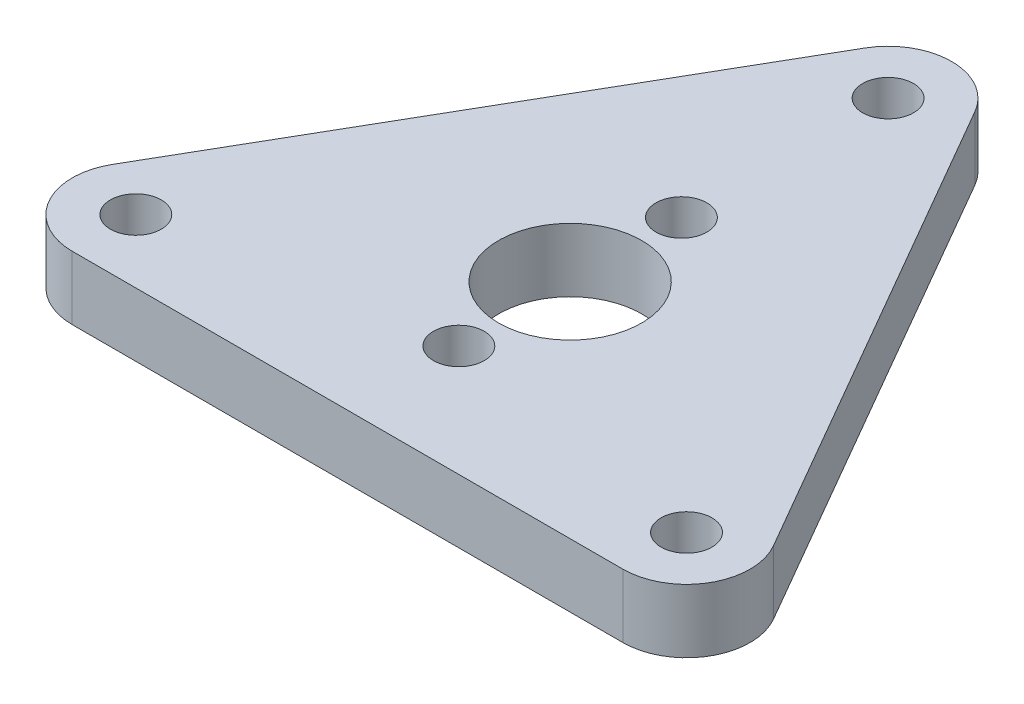
ISO-10303-21;
HEADER;
FILE_DESCRIPTION(('STEP AP214'),'2;1');
FILE_NAME('part.step','',(''),(''),'','','');
FILE_SCHEMA(('AUTOMOTIVE_DESIGN { 1 0 10303 214 1 1 1 1 }'));
ENDSEC;
DATA;
#1=APPLICATION_CONTEXT('core data for automotive mechanical design processes');
#2=APPLICATION_PROTOCOL_DEFINITION('international standard','automotive_design',2000,#1);
#3=PRODUCT_CONTEXT('',#1,'mechanical');
#4=PRODUCT('Part','Part','',(#3));
#5=PRODUCT_RELATED_PRODUCT_CATEGORY('part','',(#4));
#6=PRODUCT_DEFINITION_FORMATION('','',#4);
#7=PRODUCT_DEFINITION_CONTEXT('part definition',#1,'design');
#8=PRODUCT_DEFINITION('design','',#6,#7);
#9=PRODUCT_DEFINITION_SHAPE('','',#8);
#10=(LENGTH_UNIT() NAMED_UNIT(*) SI_UNIT(.MILLI.,.METRE.));
#11=(NAMED_UNIT(*) PLANE_ANGLE_UNIT() SI_UNIT($,.RADIAN.));
#12=(NAMED_UNIT(*) SI_UNIT($,.STERADIAN.) SOLID_ANGLE_UNIT());
#13=UNCERTAINTY_MEASURE_WITH_UNIT(LENGTH_MEASURE(1.E-05),#10,'distance_accuracy_value','');
#14=(GEOMETRIC_REPRESENTATION_CONTEXT(3) GLOBAL_UNCERTAINTY_ASSIGNED_CONTEXT((#13)) GLOBAL_UNIT_ASSIGNED_CONTEXT((#10,
#11,#12)) REPRESENTATION_CONTEXT('',''));
#15=CARTESIAN_POINT('',(0.,0.,0.));
#16=DIRECTION('',(0.,0.,1.));
#17=DIRECTION('',(1.,0.,0.));
#18=AXIS2_PLACEMENT_3D('',#15,#16,#17);
#19=CARTESIAN_POINT('',(17.3205080756888,2.,9.99999999999999));
#20=DIRECTION('',(0.,1.,0.));
#21=DIRECTION('',(0.,0.,1.));
#22=AXIS2_PLACEMENT_3D('',#19,#20,#21);
#23=PLANE('',#22);
#24=CARTESIAN_POINT('',(-17.3205080756888,2.,10.));
#25=DIRECTION('',(0.,1.,0.));
#26=DIRECTION('',(0.,0.,1.));
#27=AXIS2_PLACEMENT_3D('',#24,#25,#26);
#28=CIRCLE('',#27,1.6);
#29=CARTESIAN_POINT('',(-17.3205080756888,2.,11.6));
#30=VERTEX_POINT('',#29);
#31=EDGE_CURVE('E199',#30,#30,#28,.T.);
#32=ORIENTED_EDGE('',*,*,#31,.F.);
#33=EDGE_LOOP('',(#32));
#34=FACE_BOUND('',#33,.T.);
#35=CARTESIAN_POINT('',(0.,2.,-20.));
#36=DIRECTION('',(0.,1.,0.));
#37=DIRECTION('',(0.,0.,1.));
#38=AXIS2_PLACEMENT_3D('',#35,#36,#37);
#39=CIRCLE('',#38,1.6);
#40=CARTESIAN_POINT('',(0.,2.,-18.4));
#41=VERTEX_POINT('',#40);
#42=EDGE_CURVE('E211',#41,#41,#39,.T.);
#43=ORIENTED_EDGE('',*,*,#42,.F.);
#44=EDGE_LOOP('',(#43));
#45=FACE_BOUND('',#44,.T.);
#46=CARTESIAN_POINT('',(0.,2.,-7.));
#47=DIRECTION('',(0.,1.,0.));
#48=DIRECTION('',(0.,0.,1.));
#49=AXIS2_PLACEMENT_3D('',#46,#47,#48);
#50=CIRCLE('',#49,1.6);
#51=CARTESIAN_POINT('',(0.,2.,-5.4));
#52=VERTEX_POINT('',#51);
#53=EDGE_CURVE('E124',#52,#52,#50,.T.);
#54=ORIENTED_EDGE('',*,*,#53,.F.);
#55=EDGE_LOOP('',(#54));
#56=FACE_BOUND('',#55,.T.);
#57=CARTESIAN_POINT('',(17.3205080756888,2.,9.99999999999999));
#58=DIRECTION('',(0.,1.,0.));
#59=DIRECTION('',(0.,0.,1.));
#60=AXIS2_PLACEMENT_3D('',#57,#58,#59);
#61=CIRCLE('',#60,3.99999999999999);
#62=CARTESIAN_POINT('',(17.3205080756888,2.,14.));
#63=VERTEX_POINT('',#62);
#64=CARTESIAN_POINT('',(20.7846096908265,2.,8.));
#65=VERTEX_POINT('',#64);
#66=EDGE_CURVE('E131',#63,#65,#61,.T.);
#67=ORIENTED_EDGE('',*,*,#66,.T.);
#68=DIRECTION('',(-0.5,0.,-0.866025403784439));
#69=VECTOR('',#68,1.);
#70=CARTESIAN_POINT('',(20.7846096908265,2.,8.));
#71=LINE('',#70,#69);
#72=CARTESIAN_POINT('',(3.46410161513776,2.,-22.));
#73=VERTEX_POINT('',#72);
#74=EDGE_CURVE('E89',#65,#73,#71,.T.);
#75=ORIENTED_EDGE('',*,*,#74,.T.);
#76=CARTESIAN_POINT('',(0.,2.,-20.));
#77=DIRECTION('',(0.,1.,0.));
#78=DIRECTION('',(0.,0.,-1.));
#79=AXIS2_PLACEMENT_3D('',#76,#77,#78);
#80=CIRCLE('',#79,4.);
#81=CARTESIAN_POINT('',(-3.46410161513774,2.,-22.));
#82=VERTEX_POINT('',#81);
#83=EDGE_CURVE('E102',#73,#82,#80,.T.);
#84=ORIENTED_EDGE('',*,*,#83,.T.);
#85=DIRECTION('',(-0.500000000000001,0.,0.866025403784438));
#86=VECTOR('',#85,1.);
#87=CARTESIAN_POINT('',(-3.46410161513774,2.,-22.));
#88=LINE('',#87,#86);
#89=CARTESIAN_POINT('',(-20.7846096908265,2.,7.99999999999999));
#90=VERTEX_POINT('',#89);
#91=EDGE_CURVE('E96',#82,#90,#88,.T.);
#92=ORIENTED_EDGE('',*,*,#91,.T.);
#93=CARTESIAN_POINT('',(-17.3205080756888,2.,9.99999999999999));
#94=DIRECTION('',(0.,1.,0.));
#95=DIRECTION('',(0.,0.,1.));
#96=AXIS2_PLACEMENT_3D('',#93,#94,#95);
#97=CIRCLE('',#96,4.);
#98=CARTESIAN_POINT('',(-17.3205080756888,2.,14.));
#99=VERTEX_POINT('',#98);
#100=EDGE_CURVE('E100',#90,#99,#97,.T.);
#101=ORIENTED_EDGE('',*,*,#100,.T.);
#102=DIRECTION('',(1.,0.,0.));
#103=VECTOR('',#102,1.);
#104=CARTESIAN_POINT('',(-17.3205080756888,2.,14.));
#105=LINE('',#104,#103);
#106=EDGE_CURVE('E52',#99,#63,#105,.T.);
#107=ORIENTED_EDGE('',*,*,#106,.T.);
#108=EDGE_LOOP('',(#67,#75,#84,#92,#101,#107));
#109=FACE_BOUND('',#108,.T.);
#110=CARTESIAN_POINT('',(0.,2.,7.));
#111=DIRECTION('',(0.,1.,0.));
#112=DIRECTION('',(0.,0.,1.));
#113=AXIS2_PLACEMENT_3D('',#110,#111,#112);
#114=CIRCLE('',#113,1.6);
#115=CARTESIAN_POINT('',(0.,2.,8.6));
#116=VERTEX_POINT('',#115);
#117=EDGE_CURVE('E217',#116,#116,#114,.T.);
#118=ORIENTED_EDGE('',*,*,#117,.F.);
#119=EDGE_LOOP('',(#118));
#120=FACE_BOUND('',#119,.T.);
#121=CARTESIAN_POINT('',(17.3205080756888,2.,10.));
#122=DIRECTION('',(0.,1.,0.));
#123=DIRECTION('',(0.,0.,1.));
#124=AXIS2_PLACEMENT_3D('',#121,#122,#123);
#125=CIRCLE('',#124,1.6);
#126=CARTESIAN_POINT('',(17.3205080756888,2.,11.6));
#127=VERTEX_POINT('',#126);
#128=EDGE_CURVE('E205',#127,#127,#125,.T.);
#129=ORIENTED_EDGE('',*,*,#128,.F.);
#130=EDGE_LOOP('',(#129));
#131=FACE_BOUND('',#130,.T.);
#132=CARTESIAN_POINT('',(0.,2.,0.));
#133=DIRECTION('',(0.,1.,0.));
#134=DIRECTION('',(0.,0.,1.));
#135=AXIS2_PLACEMENT_3D('',#132,#133,#134);
#136=CIRCLE('',#135,4.5);
#137=CARTESIAN_POINT('',(0.,2.,4.5));
#138=VERTEX_POINT('',#137);
#139=EDGE_CURVE('E190',#138,#138,#136,.T.);
#140=ORIENTED_EDGE('',*,*,#139,.F.);
#141=EDGE_LOOP('',(#140));
#142=FACE_BOUND('',#141,.T.);
#143=ADVANCED_FACE('F35',(#34,#45,#56,#109,#120,#131,#142),#23,.T.);
#144=CARTESIAN_POINT('',(17.3205080756888,-2.,9.99999999999999));
#145=DIRECTION('',(0.,1.,0.));
#146=DIRECTION('',(0.,0.,1.));
#147=AXIS2_PLACEMENT_3D('',#144,#145,#146);
#148=PLANE('',#147);
#149=CARTESIAN_POINT('',(17.3205080756888,-2.,9.99999999999999));
#150=DIRECTION('',(0.,1.,0.));
#151=DIRECTION('',(0.,0.,1.));
#152=AXIS2_PLACEMENT_3D('',#149,#150,#151);
#153=CIRCLE('',#152,3.99999999999999);
#154=CARTESIAN_POINT('',(17.3205080756888,-2.,14.));
#155=VERTEX_POINT('',#154);
#156=CARTESIAN_POINT('',(20.7846096908265,-2.,8.));
#157=VERTEX_POINT('',#156);
#158=EDGE_CURVE('E120',#155,#157,#153,.T.);
#159=ORIENTED_EDGE('',*,*,#158,.F.);
#160=DIRECTION('',(1.,0.,0.));
#161=VECTOR('',#160,1.);
#162=CARTESIAN_POINT('',(-17.3205080756888,-2.,14.));
#163=LINE('',#162,#161);
#164=CARTESIAN_POINT('',(-17.3205080756888,-2.,14.));
#165=VERTEX_POINT('',#164);
#166=EDGE_CURVE('E81',#165,#155,#163,.T.);
#167=ORIENTED_EDGE('',*,*,#166,.F.);
#168=CARTESIAN_POINT('',(-17.3205080756888,-2.,9.99999999999999));
#169=DIRECTION('',(0.,1.,0.));
#170=DIRECTION('',(0.,0.,1.));
#171=AXIS2_PLACEMENT_3D('',#168,#169,#170);
#172=CIRCLE('',#171,4.);
#173=CARTESIAN_POINT('',(-20.7846096908265,-2.,7.99999999999999));
#174=VERTEX_POINT('',#173);
#175=EDGE_CURVE('E75',#174,#165,#172,.T.);
#176=ORIENTED_EDGE('',*,*,#175,.F.);
#177=DIRECTION('',(-0.500000000000001,0.,0.866025403784438));
#178=VECTOR('',#177,1.);
#179=CARTESIAN_POINT('',(-3.46410161513774,-2.,-22.));
#180=LINE('',#179,#178);
#181=CARTESIAN_POINT('',(-3.46410161513774,-2.,-22.));
#182=VERTEX_POINT('',#181);
#183=EDGE_CURVE('E110',#182,#174,#180,.T.);
#184=ORIENTED_EDGE('',*,*,#183,.F.);
#185=CARTESIAN_POINT('',(0.,-2.,-20.));
#186=DIRECTION('',(0.,1.,0.));
#187=DIRECTION('',(0.,0.,-1.));
#188=AXIS2_PLACEMENT_3D('',#185,#186,#187);
#189=CIRCLE('',#188,4.);
#190=CARTESIAN_POINT('',(3.46410161513776,-2.,-22.));
#191=VERTEX_POINT('',#190);
#192=EDGE_CURVE('E126',#191,#182,#189,.T.);
#193=ORIENTED_EDGE('',*,*,#192,.F.);
#194=DIRECTION('',(-0.5,0.,-0.866025403784439));
#195=VECTOR('',#194,1.);
#196=CARTESIAN_POINT('',(20.7846096908265,-2.,8.));
#197=LINE('',#196,#195);
#198=EDGE_CURVE('E123',#157,#191,#197,.T.);
#199=ORIENTED_EDGE('',*,*,#198,.F.);
#200=EDGE_LOOP('',(#159,#167,#176,#184,#193,#199));
#201=FACE_BOUND('',#200,.T.);
#202=CARTESIAN_POINT('',(0.,-2.,-7.));
#203=DIRECTION('',(0.,1.,0.));
#204=DIRECTION('',(0.,0.,1.));
#205=AXIS2_PLACEMENT_3D('',#202,#203,#204);
#206=CIRCLE('',#205,1.6);
#207=CARTESIAN_POINT('',(0.,-2.,-5.4));
#208=VERTEX_POINT('',#207);
#209=EDGE_CURVE('E220',#208,#208,#206,.T.);
#210=ORIENTED_EDGE('',*,*,#209,.T.);
#211=EDGE_LOOP('',(#210));
#212=FACE_BOUND('',#211,.T.);
#213=CARTESIAN_POINT('',(0.,-2.,7.));
#214=DIRECTION('',(0.,1.,0.));
#215=DIRECTION('',(0.,0.,1.));
#216=AXIS2_PLACEMENT_3D('',#213,#214,#215);
#217=CIRCLE('',#216,1.6);
#218=CARTESIAN_POINT('',(0.,-2.,8.6));
#219=VERTEX_POINT('',#218);
#220=EDGE_CURVE('E214',#219,#219,#217,.T.);
#221=ORIENTED_EDGE('',*,*,#220,.T.);
#222=EDGE_LOOP('',(#221));
#223=FACE_BOUND('',#222,.T.);
#224=CARTESIAN_POINT('',(0.,-2.,-20.));
#225=DIRECTION('',(0.,1.,0.));
#226=DIRECTION('',(0.,0.,1.));
#227=AXIS2_PLACEMENT_3D('',#224,#225,#226);
#228=CIRCLE('',#227,1.6);
#229=CARTESIAN_POINT('',(0.,-2.,-18.4));
#230=VERTEX_POINT('',#229);
#231=EDGE_CURVE('E208',#230,#230,#228,.T.);
#232=ORIENTED_EDGE('',*,*,#231,.T.);
#233=EDGE_LOOP('',(#232));
#234=FACE_BOUND('',#233,.T.);
#235=CARTESIAN_POINT('',(17.3205080756888,-2.,10.));
#236=DIRECTION('',(0.,1.,0.));
#237=DIRECTION('',(0.,0.,1.));
#238=AXIS2_PLACEMENT_3D('',#235,#236,#237);
#239=CIRCLE('',#238,1.6);
#240=CARTESIAN_POINT('',(17.3205080756888,-2.,11.6));
#241=VERTEX_POINT('',#240);
#242=EDGE_CURVE('E202',#241,#241,#239,.T.);
#243=ORIENTED_EDGE('',*,*,#242,.T.);
#244=EDGE_LOOP('',(#243));
#245=FACE_BOUND('',#244,.T.);
#246=CARTESIAN_POINT('',(-17.3205080756888,-2.,10.));
#247=DIRECTION('',(0.,1.,0.));
#248=DIRECTION('',(0.,0.,1.));
#249=AXIS2_PLACEMENT_3D('',#246,#247,#248);
#250=CIRCLE('',#249,1.6);
#251=CARTESIAN_POINT('',(-17.3205080756888,-2.,11.6));
#252=VERTEX_POINT('',#251);
#253=EDGE_CURVE('E196',#252,#252,#250,.T.);
#254=ORIENTED_EDGE('',*,*,#253,.T.);
#255=EDGE_LOOP('',(#254));
#256=FACE_BOUND('',#255,.T.);
#257=CARTESIAN_POINT('',(0.,-2.,0.));
#258=DIRECTION('',(0.,1.,0.));
#259=DIRECTION('',(0.,0.,1.));
#260=AXIS2_PLACEMENT_3D('',#257,#258,#259);
#261=CIRCLE('',#260,4.5);
#262=CARTESIAN_POINT('',(0.,-2.,4.5));
#263=VERTEX_POINT('',#262);
#264=EDGE_CURVE('E193',#263,#263,#261,.T.);
#265=ORIENTED_EDGE('',*,*,#264,.T.);
#266=EDGE_LOOP('',(#265));
#267=FACE_BOUND('',#266,.T.);
#268=ADVANCED_FACE('F140',(#201,#212,#223,#234,#245,#256,#267),#148,.F.);
#269=CARTESIAN_POINT('',(17.3205080756888,2.,9.99999999999999));
#270=DIRECTION('',(0.,-1.,0.));
#271=DIRECTION('',(0.,0.,-1.));
#272=AXIS2_PLACEMENT_3D('',#269,#270,#271);
#273=CYLINDRICAL_SURFACE('',#272,3.99999999999999);
#274=ORIENTED_EDGE('',*,*,#158,.T.);
#275=DIRECTION('',(0.,-1.,0.));
#276=VECTOR('',#275,1.);
#277=CARTESIAN_POINT('',(20.7846096908265,2.,8.));
#278=LINE('',#277,#276);
#279=EDGE_CURVE('E11',#65,#157,#278,.T.);
#280=ORIENTED_EDGE('',*,*,#279,.F.);
#281=ORIENTED_EDGE('',*,*,#66,.F.);
#282=DIRECTION('',(0.,-1.,0.));
#283=VECTOR('',#282,1.);
#284=CARTESIAN_POINT('',(17.3205080756888,2.,14.));
#285=LINE('',#284,#283);
#286=EDGE_CURVE('E116',#63,#155,#285,.T.);
#287=ORIENTED_EDGE('',*,*,#286,.T.);
#288=EDGE_LOOP('',(#274,#280,#281,#287));
#289=FACE_BOUND('',#288,.T.);
#290=ADVANCED_FACE('F37',(#289),#273,.T.);
#291=CARTESIAN_POINT('',(20.7846096908265,2.,8.));
#292=DIRECTION('',(-0.866025403784439,0.,0.5));
#293=DIRECTION('',(0.5,0.,0.866025403784439));
#294=AXIS2_PLACEMENT_3D('',#291,#292,#293);
#295=PLANE('',#294);
#296=ORIENTED_EDGE('',*,*,#198,.T.);
#297=DIRECTION('',(0.,-1.,0.));
#298=VECTOR('',#297,1.);
#299=CARTESIAN_POINT('',(3.46410161513776,2.,-22.));
#300=LINE('',#299,#298);
#301=EDGE_CURVE('E44',#73,#191,#300,.T.);
#302=ORIENTED_EDGE('',*,*,#301,.F.);
#303=ORIENTED_EDGE('',*,*,#74,.F.);
#304=ORIENTED_EDGE('',*,*,#279,.T.);
#305=EDGE_LOOP('',(#296,#302,#303,#304));
#306=FACE_BOUND('',#305,.T.);
#307=ADVANCED_FACE('F296',(#306),#295,.F.);
#308=CARTESIAN_POINT('',(0.,2.,-20.));
#309=DIRECTION('',(0.,-1.,0.));
#310=DIRECTION('',(0.,0.,-1.));
#311=AXIS2_PLACEMENT_3D('',#308,#309,#310);
#312=CYLINDRICAL_SURFACE('',#311,4.);
#313=ORIENTED_EDGE('',*,*,#192,.T.);
#314=DIRECTION('',(0.,-1.,0.));
#315=VECTOR('',#314,1.);
#316=CARTESIAN_POINT('',(-3.46410161513774,2.,-22.));
#317=LINE('',#316,#315);
#318=EDGE_CURVE('E111',#82,#182,#317,.T.);
#319=ORIENTED_EDGE('',*,*,#318,.F.);
#320=ORIENTED_EDGE('',*,*,#83,.F.);
#321=ORIENTED_EDGE('',*,*,#301,.T.);
#322=EDGE_LOOP('',(#313,#319,#320,#321));
#323=FACE_BOUND('',#322,.T.);
#324=ADVANCED_FACE('F137',(#323),#312,.T.);
#325=CARTESIAN_POINT('',(-3.46410161513774,2.,-22.));
#326=DIRECTION('',(0.866025403784438,0.,0.500000000000001));
#327=DIRECTION('',(0.500000000000001,0.,-0.866025403784438));
#328=AXIS2_PLACEMENT_3D('',#325,#326,#327);
#329=PLANE('',#328);
#330=ORIENTED_EDGE('',*,*,#183,.T.);
#331=DIRECTION('',(0.,-1.,0.));
#332=VECTOR('',#331,1.);
#333=CARTESIAN_POINT('',(-20.7846096908265,2.,7.99999999999999));
#334=LINE('',#333,#332);
#335=EDGE_CURVE('E107',#90,#174,#334,.T.);
#336=ORIENTED_EDGE('',*,*,#335,.F.);
#337=ORIENTED_EDGE('',*,*,#91,.F.);
#338=ORIENTED_EDGE('',*,*,#318,.T.);
#339=EDGE_LOOP('',(#330,#336,#337,#338));
#340=FACE_BOUND('',#339,.T.);
#341=ADVANCED_FACE('F108',(#340),#329,.F.);
#342=CARTESIAN_POINT('',(-17.3205080756888,2.,9.99999999999999));
#343=DIRECTION('',(0.,-1.,0.));
#344=DIRECTION('',(0.,0.,-1.));
#345=AXIS2_PLACEMENT_3D('',#342,#343,#344);
#346=CYLINDRICAL_SURFACE('',#345,4.);
#347=ORIENTED_EDGE('',*,*,#175,.T.);
#348=DIRECTION('',(0.,-1.,0.));
#349=VECTOR('',#348,1.);
#350=CARTESIAN_POINT('',(-17.3205080756888,2.,14.));
#351=LINE('',#350,#349);
#352=EDGE_CURVE('E112',#99,#165,#351,.T.);
#353=ORIENTED_EDGE('',*,*,#352,.F.);
#354=ORIENTED_EDGE('',*,*,#100,.F.);
#355=ORIENTED_EDGE('',*,*,#335,.T.);
#356=EDGE_LOOP('',(#347,#353,#354,#355));
#357=FACE_BOUND('',#356,.T.);
#358=ADVANCED_FACE('F114',(#357),#346,.T.);
#359=CARTESIAN_POINT('',(-17.3205080756888,2.,14.));
#360=DIRECTION('',(0.,0.,-1.));
#361=DIRECTION('',(-1.,0.,0.));
#362=AXIS2_PLACEMENT_3D('',#359,#360,#361);
#363=PLANE('',#362);
#364=ORIENTED_EDGE('',*,*,#166,.T.);
#365=ORIENTED_EDGE('',*,*,#286,.F.);
#366=ORIENTED_EDGE('',*,*,#106,.F.);
#367=ORIENTED_EDGE('',*,*,#352,.T.);
#368=EDGE_LOOP('',(#364,#365,#366,#367));
#369=FACE_BOUND('',#368,.T.);
#370=ADVANCED_FACE('F145',(#369),#363,.F.);
#371=CARTESIAN_POINT('',(0.,2.,-7.));
#372=DIRECTION('',(0.,-1.,0.));
#373=DIRECTION('',(0.,0.,-1.));
#374=AXIS2_PLACEMENT_3D('',#371,#372,#373);
#375=CYLINDRICAL_SURFACE('',#374,1.6);
#376=ORIENTED_EDGE('',*,*,#53,.T.);
#377=EDGE_LOOP('',(#376));
#378=FACE_BOUND('',#377,.T.);
#379=ORIENTED_EDGE('',*,*,#209,.F.);
#380=EDGE_LOOP('',(#379));
#381=FACE_BOUND('',#380,.T.);
#382=ADVANCED_FACE('F147',(#378,#381),#375,.F.);
#383=CARTESIAN_POINT('',(0.,2.,7.));
#384=DIRECTION('',(0.,-1.,0.));
#385=DIRECTION('',(0.,0.,-1.));
#386=AXIS2_PLACEMENT_3D('',#383,#384,#385);
#387=CYLINDRICAL_SURFACE('',#386,1.6);
#388=ORIENTED_EDGE('',*,*,#117,.T.);
#389=EDGE_LOOP('',(#388));
#390=FACE_BOUND('',#389,.T.);
#391=ORIENTED_EDGE('',*,*,#220,.F.);
#392=EDGE_LOOP('',(#391));
#393=FACE_BOUND('',#392,.T.);
#394=ADVANCED_FACE('F153',(#390,#393),#387,.F.);
#395=CARTESIAN_POINT('',(0.,2.,-20.));
#396=DIRECTION('',(0.,-1.,0.));
#397=DIRECTION('',(0.,0.,-1.));
#398=AXIS2_PLACEMENT_3D('',#395,#396,#397);
#399=CYLINDRICAL_SURFACE('',#398,1.6);
#400=ORIENTED_EDGE('',*,*,#42,.T.);
#401=EDGE_LOOP('',(#400));
#402=FACE_BOUND('',#401,.T.);
#403=ORIENTED_EDGE('',*,*,#231,.F.);
#404=EDGE_LOOP('',(#403));
#405=FACE_BOUND('',#404,.T.);
#406=ADVANCED_FACE('F169',(#402,#405),#399,.F.);
#407=CARTESIAN_POINT('',(17.3205080756888,2.,10.));
#408=DIRECTION('',(0.,-1.,0.));
#409=DIRECTION('',(0.,0.,-1.));
#410=AXIS2_PLACEMENT_3D('',#407,#408,#409);
#411=CYLINDRICAL_SURFACE('',#410,1.6);
#412=ORIENTED_EDGE('',*,*,#128,.T.);
#413=EDGE_LOOP('',(#412));
#414=FACE_BOUND('',#413,.T.);
#415=ORIENTED_EDGE('',*,*,#242,.F.);
#416=EDGE_LOOP('',(#415));
#417=FACE_BOUND('',#416,.T.);
#418=ADVANCED_FACE('F173',(#414,#417),#411,.F.);
#419=CARTESIAN_POINT('',(-17.3205080756888,2.,10.));
#420=DIRECTION('',(0.,-1.,0.));
#421=DIRECTION('',(0.,0.,-1.));
#422=AXIS2_PLACEMENT_3D('',#419,#420,#421);
#423=CYLINDRICAL_SURFACE('',#422,1.6);
#424=ORIENTED_EDGE('',*,*,#31,.T.);
#425=EDGE_LOOP('',(#424));
#426=FACE_BOUND('',#425,.T.);
#427=ORIENTED_EDGE('',*,*,#253,.F.);
#428=EDGE_LOOP('',(#427));
#429=FACE_BOUND('',#428,.T.);
#430=ADVANCED_FACE('F177',(#426,#429),#423,.F.);
#431=CARTESIAN_POINT('',(0.,2.,0.));
#432=DIRECTION('',(0.,-1.,0.));
#433=DIRECTION('',(0.,0.,-1.));
#434=AXIS2_PLACEMENT_3D('',#431,#432,#433);
#435=CYLINDRICAL_SURFACE('',#434,4.5);
#436=ORIENTED_EDGE('',*,*,#139,.T.);
#437=EDGE_LOOP('',(#436));
#438=FACE_BOUND('',#437,.T.);
#439=ORIENTED_EDGE('',*,*,#264,.F.);
#440=EDGE_LOOP('',(#439));
#441=FACE_BOUND('',#440,.T.);
#442=ADVANCED_FACE('F181',(#438,#441),#435,.F.);
#443=CLOSED_SHELL('',(#143,#268,#290,#307,#324,#341,#358,#370,#382,#394,#406,#418,#430,#442));
#444=MANIFOLD_SOLID_BREP('B2',#443);
#445=ADVANCED_BREP_SHAPE_REPRESENTATION('',(#18,#444),#14);
#446=SHAPE_DEFINITION_REPRESENTATION(#9,#445);
ENDSEC;
END-ISO-10303-21;
